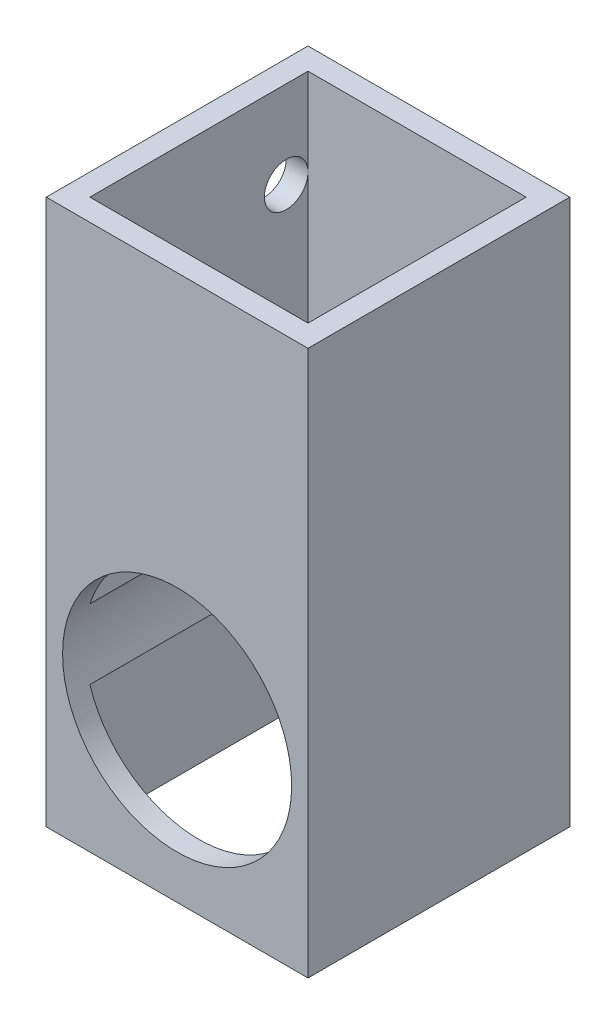
ISO-10303-21;
HEADER;
FILE_DESCRIPTION(('STEP AP214'),'2;1');
FILE_NAME('part.step','',(''),(''),'','','');
FILE_SCHEMA(('AUTOMOTIVE_DESIGN { 1 0 10303 214 1 1 1 1 }'));
ENDSEC;
DATA;
#1=APPLICATION_CONTEXT('core data for automotive mechanical design processes');
#2=APPLICATION_PROTOCOL_DEFINITION('international standard','automotive_design',2000,#1);
#3=PRODUCT_CONTEXT('',#1,'mechanical');
#4=PRODUCT('Part','Part','',(#3));
#5=PRODUCT_RELATED_PRODUCT_CATEGORY('part','',(#4));
#6=PRODUCT_DEFINITION_FORMATION('','',#4);
#7=PRODUCT_DEFINITION_CONTEXT('part definition',#1,'design');
#8=PRODUCT_DEFINITION('design','',#6,#7);
#9=PRODUCT_DEFINITION_SHAPE('','',#8);
#10=(LENGTH_UNIT() NAMED_UNIT(*) SI_UNIT(.MILLI.,.METRE.));
#11=(NAMED_UNIT(*) PLANE_ANGLE_UNIT() SI_UNIT($,.RADIAN.));
#12=(NAMED_UNIT(*) SI_UNIT($,.STERADIAN.) SOLID_ANGLE_UNIT());
#13=UNCERTAINTY_MEASURE_WITH_UNIT(LENGTH_MEASURE(1.E-05),#10,'distance_accuracy_value','');
#14=(GEOMETRIC_REPRESENTATION_CONTEXT(3) GLOBAL_UNCERTAINTY_ASSIGNED_CONTEXT((#13)) GLOBAL_UNIT_ASSIGNED_CONTEXT((#10,
#11,#12)) REPRESENTATION_CONTEXT('',''));
#15=CARTESIAN_POINT('',(0.,0.,0.));
#16=DIRECTION('',(0.,0.,1.));
#17=DIRECTION('',(1.,0.,0.));
#18=AXIS2_PLACEMENT_3D('',#15,#16,#17);
#19=CARTESIAN_POINT('',(12.1552561210692,66.675,-6.35));
#20=DIRECTION('',(-1.,0.,0.));
#21=DIRECTION('',(0.,0.,1.));
#22=AXIS2_PLACEMENT_3D('',#19,#20,#21);
#23=CYLINDRICAL_SURFACE('',#22,3.175);
#24=CARTESIAN_POINT('',(3.175,66.675,-6.35));
#25=DIRECTION('',(-1.,0.,0.));
#26=DIRECTION('',(0.,0.,1.));
#27=AXIS2_PLACEMENT_3D('',#24,#25,#26);
#28=CIRCLE('',#27,3.175);
#29=CARTESIAN_POINT('',(3.175,66.675,-3.175));
#30=VERTEX_POINT('',#29);
#31=EDGE_CURVE('E113',#30,#30,#28,.T.);
#32=ORIENTED_EDGE('',*,*,#31,.F.);
#33=EDGE_LOOP('',(#32));
#34=FACE_BOUND('',#33,.T.);
#35=CARTESIAN_POINT('',(0.,66.675,-6.35));
#36=DIRECTION('',(-1.,0.,0.));
#37=DIRECTION('',(0.,0.,1.));
#38=AXIS2_PLACEMENT_3D('',#35,#36,#37);
#39=CIRCLE('',#38,3.175);
#40=CARTESIAN_POINT('',(0.,66.675,-3.175));
#41=VERTEX_POINT('',#40);
#42=EDGE_CURVE('E198',#41,#41,#39,.T.);
#43=ORIENTED_EDGE('',*,*,#42,.T.);
#44=EDGE_LOOP('',(#43));
#45=FACE_BOUND('',#44,.T.);
#46=ADVANCED_FACE('F16',(#34,#45),#23,.F.);
#47=CARTESIAN_POINT('',(12.1552561210692,66.675,-31.75));
#48=DIRECTION('',(-1.,0.,0.));
#49=DIRECTION('',(0.,0.,1.));
#50=AXIS2_PLACEMENT_3D('',#47,#48,#49);
#51=CYLINDRICAL_SURFACE('',#50,3.175);
#52=CARTESIAN_POINT('',(3.175,66.675,-31.75));
#53=DIRECTION('',(-1.,0.,0.));
#54=DIRECTION('',(0.,0.,1.));
#55=AXIS2_PLACEMENT_3D('',#52,#53,#54);
#56=CIRCLE('',#55,3.175);
#57=CARTESIAN_POINT('',(3.175,66.675,-28.575));
#58=VERTEX_POINT('',#57);
#59=EDGE_CURVE('E208',#58,#58,#56,.T.);
#60=ORIENTED_EDGE('',*,*,#59,.F.);
#61=EDGE_LOOP('',(#60));
#62=FACE_BOUND('',#61,.T.);
#63=CARTESIAN_POINT('',(0.,66.675,-31.75));
#64=DIRECTION('',(-1.,0.,0.));
#65=DIRECTION('',(0.,0.,1.));
#66=AXIS2_PLACEMENT_3D('',#63,#64,#65);
#67=CIRCLE('',#66,3.175);
#68=CARTESIAN_POINT('',(0.,66.675,-28.575));
#69=VERTEX_POINT('',#68);
#70=EDGE_CURVE('E195',#69,#69,#67,.T.);
#71=ORIENTED_EDGE('',*,*,#70,.T.);
#72=EDGE_LOOP('',(#71));
#73=FACE_BOUND('',#72,.T.);
#74=ADVANCED_FACE('F217',(#62,#73),#51,.F.);
#75=CARTESIAN_POINT('',(12.1552561210692,53.975,-19.05));
#76=DIRECTION('',(-1.,0.,0.));
#77=DIRECTION('',(0.,0.,1.));
#78=AXIS2_PLACEMENT_3D('',#75,#76,#77);
#79=CYLINDRICAL_SURFACE('',#78,3.175);
#80=CARTESIAN_POINT('',(3.175,53.975,-19.05));
#81=DIRECTION('',(-1.,0.,0.));
#82=DIRECTION('',(0.,0.,1.));
#83=AXIS2_PLACEMENT_3D('',#80,#81,#82);
#84=CIRCLE('',#83,3.175);
#85=CARTESIAN_POINT('',(3.175,53.975,-15.875));
#86=VERTEX_POINT('',#85);
#87=EDGE_CURVE('E19',#86,#86,#84,.T.);
#88=ORIENTED_EDGE('',*,*,#87,.F.);
#89=EDGE_LOOP('',(#88));
#90=FACE_BOUND('',#89,.T.);
#91=CARTESIAN_POINT('',(0.,53.975,-19.05));
#92=DIRECTION('',(-1.,0.,0.));
#93=DIRECTION('',(0.,0.,1.));
#94=AXIS2_PLACEMENT_3D('',#91,#92,#93);
#95=CIRCLE('',#94,3.175);
#96=CARTESIAN_POINT('',(0.,53.975,-15.875));
#97=VERTEX_POINT('',#96);
#98=EDGE_CURVE('E163',#97,#97,#95,.T.);
#99=ORIENTED_EDGE('',*,*,#98,.T.);
#100=EDGE_LOOP('',(#99));
#101=FACE_BOUND('',#100,.T.);
#102=ADVANCED_FACE('F298',(#90,#101),#79,.F.);
#103=CARTESIAN_POINT('',(34.925,79.375,-3.175));
#104=DIRECTION('',(-1.,0.,0.));
#105=DIRECTION('',(0.,0.,1.));
#106=AXIS2_PLACEMENT_3D('',#103,#104,#105);
#107=PLANE('',#106);
#108=DIRECTION('',(0.,0.,-1.));
#109=VECTOR('',#108,1.);
#110=CARTESIAN_POINT('',(34.925,79.375,0.));
#111=LINE('',#110,#109);
#112=CARTESIAN_POINT('',(34.925,79.375,-3.175));
#113=VERTEX_POINT('',#112);
#114=CARTESIAN_POINT('',(34.925,79.375,-34.925));
#115=VERTEX_POINT('',#114);
#116=EDGE_CURVE('E126',#113,#115,#111,.T.);
#117=ORIENTED_EDGE('',*,*,#116,.T.);
#118=DIRECTION('',(0.,1.,0.));
#119=VECTOR('',#118,1.);
#120=CARTESIAN_POINT('',(34.925,79.375,-34.925));
#121=LINE('',#120,#119);
#122=CARTESIAN_POINT('',(34.925,28.1012298634623,-34.925));
#123=VERTEX_POINT('',#122);
#124=EDGE_CURVE('E125',#123,#115,#121,.T.);
#125=ORIENTED_EDGE('',*,*,#124,.F.);
#126=DIRECTION('',(0.,0.,1.));
#127=VECTOR('',#126,1.);
#128=CARTESIAN_POINT('',(34.925,28.1012298634623,-38.1));
#129=LINE('',#128,#127);
#130=CARTESIAN_POINT('',(34.925,28.1012298634623,-3.175));
#131=VERTEX_POINT('',#130);
#132=EDGE_CURVE('E177',#123,#131,#129,.T.);
#133=ORIENTED_EDGE('',*,*,#132,.T.);
#134=DIRECTION('',(0.,1.,0.));
#135=VECTOR('',#134,1.);
#136=CARTESIAN_POINT('',(34.925,79.375,-3.175));
#137=LINE('',#136,#135);
#138=EDGE_CURVE('E205',#113,#131,#137,.F.);
#139=ORIENTED_EDGE('',*,*,#138,.F.);
#140=EDGE_LOOP('',(#117,#125,#133,#139));
#141=FACE_BOUND('',#140,.T.);
#142=ADVANCED_FACE('F296',(#141),#107,.T.);
#143=CARTESIAN_POINT('',(3.175,79.375,-34.925));
#144=DIRECTION('',(0.,0.,1.));
#145=DIRECTION('',(1.,0.,0.));
#146=AXIS2_PLACEMENT_3D('',#143,#144,#145);
#147=PLANE('',#146);
#148=DIRECTION('',(0.,1.,0.));
#149=VECTOR('',#148,1.);
#150=CARTESIAN_POINT('',(3.175,79.375,-34.925));
#151=LINE('',#150,#149);
#152=CARTESIAN_POINT('',(3.175,28.1012298634623,-34.925));
#153=VERTEX_POINT('',#152);
#154=CARTESIAN_POINT('',(3.175,79.375,-34.925));
#155=VERTEX_POINT('',#154);
#156=EDGE_CURVE('E102',#153,#155,#151,.T.);
#157=ORIENTED_EDGE('',*,*,#156,.F.);
#158=CARTESIAN_POINT('',(19.05,23.01875,-34.925));
#159=DIRECTION('',(0.,0.,1.));
#160=DIRECTION('',(1.,0.,0.));
#161=AXIS2_PLACEMENT_3D('',#158,#159,#160);
#162=CIRCLE('',#161,16.66875);
#163=EDGE_CURVE('E181',#153,#123,#162,.F.);
#164=ORIENTED_EDGE('',*,*,#163,.T.);
#165=ORIENTED_EDGE('',*,*,#124,.T.);
#166=DIRECTION('',(1.,0.,0.));
#167=VECTOR('',#166,1.);
#168=CARTESIAN_POINT('',(0.,79.375,-34.925));
#169=LINE('',#168,#167);
#170=EDGE_CURVE('E119',#115,#155,#169,.F.);
#171=ORIENTED_EDGE('',*,*,#170,.T.);
#172=EDGE_LOOP('',(#157,#164,#165,#171));
#173=FACE_BOUND('',#172,.T.);
#174=ADVANCED_FACE('F124',(#173),#147,.T.);
#175=CARTESIAN_POINT('',(3.175,79.375,-3.175));
#176=DIRECTION('',(1.,0.,0.));
#177=DIRECTION('',(0.,0.,-1.));
#178=AXIS2_PLACEMENT_3D('',#175,#176,#177);
#179=PLANE('',#178);
#180=ORIENTED_EDGE('',*,*,#59,.T.);
#181=EDGE_LOOP('',(#180));
#182=FACE_BOUND('',#181,.T.);
#183=ORIENTED_EDGE('',*,*,#31,.T.);
#184=EDGE_LOOP('',(#183));
#185=FACE_BOUND('',#184,.T.);
#186=ORIENTED_EDGE('',*,*,#156,.T.);
#187=DIRECTION('',(0.,0.,-1.));
#188=VECTOR('',#187,1.);
#189=CARTESIAN_POINT('',(3.175,79.375,-3.175));
#190=LINE('',#189,#188);
#191=CARTESIAN_POINT('',(3.175,79.375,-3.175));
#192=VERTEX_POINT('',#191);
#193=EDGE_CURVE('E106',#155,#192,#190,.F.);
#194=ORIENTED_EDGE('',*,*,#193,.T.);
#195=DIRECTION('',(0.,1.,0.));
#196=VECTOR('',#195,1.);
#197=CARTESIAN_POINT('',(3.175,79.375,-3.175));
#198=LINE('',#197,#196);
#199=CARTESIAN_POINT('',(3.175,28.1012298634623,-3.175));
#200=VERTEX_POINT('',#199);
#201=EDGE_CURVE('E206',#200,#192,#198,.T.);
#202=ORIENTED_EDGE('',*,*,#201,.F.);
#203=DIRECTION('',(0.,0.,-1.));
#204=VECTOR('',#203,1.);
#205=CARTESIAN_POINT('',(3.175,28.1012298634623,-3.175));
#206=LINE('',#205,#204);
#207=EDGE_CURVE('E108',#200,#153,#206,.T.);
#208=ORIENTED_EDGE('',*,*,#207,.T.);
#209=EDGE_LOOP('',(#186,#194,#202,#208));
#210=FACE_BOUND('',#209,.T.);
#211=ORIENTED_EDGE('',*,*,#87,.T.);
#212=EDGE_LOOP('',(#211));
#213=FACE_BOUND('',#212,.T.);
#214=ADVANCED_FACE('F104',(#182,#185,#210,#213),#179,.T.);
#215=CARTESIAN_POINT('',(3.175,79.375,-3.175));
#216=DIRECTION('',(0.,0.,-1.));
#217=DIRECTION('',(-1.,0.,0.));
#218=AXIS2_PLACEMENT_3D('',#215,#216,#217);
#219=PLANE('',#218);
#220=DIRECTION('',(1.,0.,0.));
#221=VECTOR('',#220,1.);
#222=CARTESIAN_POINT('',(0.,79.375,-3.175));
#223=LINE('',#222,#221);
#224=EDGE_CURVE('E122',#192,#113,#223,.T.);
#225=ORIENTED_EDGE('',*,*,#224,.T.);
#226=ORIENTED_EDGE('',*,*,#138,.T.);
#227=CARTESIAN_POINT('',(19.05,23.01875,-3.175));
#228=DIRECTION('',(0.,0.,1.));
#229=DIRECTION('',(1.,0.,0.));
#230=AXIS2_PLACEMENT_3D('',#227,#228,#229);
#231=CIRCLE('',#230,16.66875);
#232=EDGE_CURVE('E180',#131,#200,#231,.T.);
#233=ORIENTED_EDGE('',*,*,#232,.T.);
#234=ORIENTED_EDGE('',*,*,#201,.T.);
#235=EDGE_LOOP('',(#225,#226,#233,#234));
#236=FACE_BOUND('',#235,.T.);
#237=ADVANCED_FACE('F234',(#236),#219,.T.);
#238=CARTESIAN_POINT('',(19.05,23.01875,-38.1));
#239=DIRECTION('',(0.,0.,1.));
#240=DIRECTION('',(1.,0.,0.));
#241=AXIS2_PLACEMENT_3D('',#238,#239,#240);
#242=CYLINDRICAL_SURFACE('',#241,16.66875);
#243=CARTESIAN_POINT('',(19.05,23.01875,-38.1));
#244=DIRECTION('',(0.,0.,1.));
#245=DIRECTION('',(1.,0.,0.));
#246=AXIS2_PLACEMENT_3D('',#243,#244,#245);
#247=CIRCLE('',#246,16.66875);
#248=CARTESIAN_POINT('',(35.71875,23.01875,-38.1));
#249=VERTEX_POINT('',#248);
#250=EDGE_CURVE('E137',#249,#249,#247,.F.);
#251=ORIENTED_EDGE('',*,*,#250,.T.);
#252=EDGE_LOOP('',(#251));
#253=FACE_BOUND('',#252,.T.);
#254=ORIENTED_EDGE('',*,*,#132,.F.);
#255=ORIENTED_EDGE('',*,*,#163,.F.);
#256=ORIENTED_EDGE('',*,*,#207,.F.);
#257=ORIENTED_EDGE('',*,*,#232,.F.);
#258=EDGE_LOOP('',(#254,#255,#256,#257));
#259=FACE_BOUND('',#258,.T.);
#260=CARTESIAN_POINT('',(19.05,23.01875,0.));
#261=DIRECTION('',(0.,0.,1.));
#262=DIRECTION('',(1.,0.,0.));
#263=AXIS2_PLACEMENT_3D('',#260,#261,#262);
#264=CIRCLE('',#263,16.66875);
#265=CARTESIAN_POINT('',(35.71875,23.01875,0.));
#266=VERTEX_POINT('',#265);
#267=EDGE_CURVE('E185',#266,#266,#264,.T.);
#268=ORIENTED_EDGE('',*,*,#267,.T.);
#269=EDGE_LOOP('',(#268));
#270=FACE_BOUND('',#269,.T.);
#271=DIRECTION('',(0.,0.,-1.));
#272=VECTOR('',#271,1.);
#273=CARTESIAN_POINT('',(3.175,17.9362701365377,-3.175));
#274=LINE('',#273,#272);
#275=CARTESIAN_POINT('',(3.175,17.9362701365377,-34.925));
#276=VERTEX_POINT('',#275);
#277=CARTESIAN_POINT('',(3.175,17.9362701365377,-3.175));
#278=VERTEX_POINT('',#277);
#279=EDGE_CURVE('E160',#276,#278,#274,.F.);
#280=ORIENTED_EDGE('',*,*,#279,.F.);
#281=CARTESIAN_POINT('',(19.05,23.01875,-34.925));
#282=DIRECTION('',(0.,0.,1.));
#283=DIRECTION('',(1.,0.,0.));
#284=AXIS2_PLACEMENT_3D('',#281,#282,#283);
#285=CIRCLE('',#284,16.66875);
#286=CARTESIAN_POINT('',(34.925,17.9362701365377,-34.925));
#287=VERTEX_POINT('',#286);
#288=EDGE_CURVE('E171',#287,#276,#285,.F.);
#289=ORIENTED_EDGE('',*,*,#288,.F.);
#290=DIRECTION('',(0.,0.,1.));
#291=VECTOR('',#290,1.);
#292=CARTESIAN_POINT('',(34.925,17.9362701365377,-3.175));
#293=LINE('',#292,#291);
#294=CARTESIAN_POINT('',(34.925,17.9362701365377,-3.175));
#295=VERTEX_POINT('',#294);
#296=EDGE_CURVE('E145',#295,#287,#293,.F.);
#297=ORIENTED_EDGE('',*,*,#296,.F.);
#298=CARTESIAN_POINT('',(19.05,23.01875,-3.175));
#299=DIRECTION('',(0.,0.,1.));
#300=DIRECTION('',(1.,0.,0.));
#301=AXIS2_PLACEMENT_3D('',#298,#299,#300);
#302=CIRCLE('',#301,16.66875);
#303=EDGE_CURVE('E162',#278,#295,#302,.T.);
#304=ORIENTED_EDGE('',*,*,#303,.F.);
#305=EDGE_LOOP('',(#280,#289,#297,#304));
#306=FACE_BOUND('',#305,.T.);
#307=ADVANCED_FACE('F223',(#253,#259,#270,#306),#242,.F.);
#308=CARTESIAN_POINT('',(0.,79.375,0.));
#309=DIRECTION('',(1.,0.,0.));
#310=DIRECTION('',(0.,0.,-1.));
#311=AXIS2_PLACEMENT_3D('',#308,#309,#310);
#312=PLANE('',#311);
#313=DIRECTION('',(0.,1.,0.));
#314=VECTOR('',#313,1.);
#315=CARTESIAN_POINT('',(0.,79.375,0.));
#316=LINE('',#315,#314);
#317=CARTESIAN_POINT('',(0.,0.,0.));
#318=VERTEX_POINT('',#317);
#319=CARTESIAN_POINT('',(0.,79.375,0.));
#320=VERTEX_POINT('',#319);
#321=EDGE_CURVE('E188',#318,#320,#316,.T.);
#322=ORIENTED_EDGE('',*,*,#321,.T.);
#323=DIRECTION('',(0.,0.,-1.));
#324=VECTOR('',#323,1.);
#325=CARTESIAN_POINT('',(0.,79.375,0.));
#326=LINE('',#325,#324);
#327=CARTESIAN_POINT('',(0.,79.375,-38.1));
#328=VERTEX_POINT('',#327);
#329=EDGE_CURVE('E128',#320,#328,#326,.T.);
#330=ORIENTED_EDGE('',*,*,#329,.T.);
#331=DIRECTION('',(0.,1.,0.));
#332=VECTOR('',#331,1.);
#333=CARTESIAN_POINT('',(0.,79.375,-38.1));
#334=LINE('',#333,#332);
#335=CARTESIAN_POINT('',(0.,0.,-38.1));
#336=VERTEX_POINT('',#335);
#337=EDGE_CURVE('E450',#328,#336,#334,.F.);
#338=ORIENTED_EDGE('',*,*,#337,.T.);
#339=DIRECTION('',(0.,0.,-1.));
#340=VECTOR('',#339,1.);
#341=CARTESIAN_POINT('',(0.,0.,0.));
#342=LINE('',#341,#340);
#343=EDGE_CURVE('E453',#318,#336,#342,.T.);
#344=ORIENTED_EDGE('',*,*,#343,.F.);
#345=EDGE_LOOP('',(#322,#330,#338,#344));
#346=FACE_BOUND('',#345,.T.);
#347=ORIENTED_EDGE('',*,*,#98,.F.);
#348=EDGE_LOOP('',(#347));
#349=FACE_BOUND('',#348,.T.);
#350=ORIENTED_EDGE('',*,*,#70,.F.);
#351=EDGE_LOOP('',(#350));
#352=FACE_BOUND('',#351,.T.);
#353=ORIENTED_EDGE('',*,*,#42,.F.);
#354=EDGE_LOOP('',(#353));
#355=FACE_BOUND('',#354,.T.);
#356=ADVANCED_FACE('F220',(#346,#349,#352,#355),#312,.F.);
#357=CARTESIAN_POINT('',(3.175,79.375,-3.175));
#358=DIRECTION('',(1.,0.,0.));
#359=DIRECTION('',(0.,0.,-1.));
#360=AXIS2_PLACEMENT_3D('',#357,#358,#359);
#361=PLANE('',#360);
#362=DIRECTION('',(0.,0.,-1.));
#363=VECTOR('',#362,1.);
#364=CARTESIAN_POINT('',(3.175,0.,0.));
#365=LINE('',#364,#363);
#366=CARTESIAN_POINT('',(3.175,0.,-34.925));
#367=VERTEX_POINT('',#366);
#368=CARTESIAN_POINT('',(3.175,0.,-3.175));
#369=VERTEX_POINT('',#368);
#370=EDGE_CURVE('E164',#367,#369,#365,.F.);
#371=ORIENTED_EDGE('',*,*,#370,.F.);
#372=DIRECTION('',(0.,1.,0.));
#373=VECTOR('',#372,1.);
#374=CARTESIAN_POINT('',(3.17500000000001,79.375,-34.925));
#375=LINE('',#374,#373);
#376=EDGE_CURVE('E191',#276,#367,#375,.F.);
#377=ORIENTED_EDGE('',*,*,#376,.F.);
#378=ORIENTED_EDGE('',*,*,#279,.T.);
#379=DIRECTION('',(0.,1.,0.));
#380=VECTOR('',#379,1.);
#381=CARTESIAN_POINT('',(3.175,79.375,-3.175));
#382=LINE('',#381,#380);
#383=EDGE_CURVE('E148',#369,#278,#382,.T.);
#384=ORIENTED_EDGE('',*,*,#383,.F.);
#385=EDGE_LOOP('',(#371,#377,#378,#384));
#386=FACE_BOUND('',#385,.T.);
#387=ADVANCED_FACE('F222',(#386),#361,.T.);
#388=CARTESIAN_POINT('',(3.175,79.375,-3.175));
#389=DIRECTION('',(0.,0.,-1.));
#390=DIRECTION('',(-1.,0.,0.));
#391=AXIS2_PLACEMENT_3D('',#388,#389,#390);
#392=PLANE('',#391);
#393=DIRECTION('',(1.,0.,0.));
#394=VECTOR('',#393,1.);
#395=CARTESIAN_POINT('',(0.,0.,-3.175));
#396=LINE('',#395,#394);
#397=CARTESIAN_POINT('',(34.925,0.,-3.175));
#398=VERTEX_POINT('',#397);
#399=EDGE_CURVE('E152',#369,#398,#396,.T.);
#400=ORIENTED_EDGE('',*,*,#399,.F.);
#401=ORIENTED_EDGE('',*,*,#383,.T.);
#402=ORIENTED_EDGE('',*,*,#303,.T.);
#403=DIRECTION('',(0.,1.,0.));
#404=VECTOR('',#403,1.);
#405=CARTESIAN_POINT('',(34.925,79.375,-3.175));
#406=LINE('',#405,#404);
#407=EDGE_CURVE('E147',#398,#295,#406,.T.);
#408=ORIENTED_EDGE('',*,*,#407,.F.);
#409=EDGE_LOOP('',(#400,#401,#402,#408));
#410=FACE_BOUND('',#409,.T.);
#411=ADVANCED_FACE('F231',(#410),#392,.T.);
#412=CARTESIAN_POINT('',(34.925,79.375,-3.175));
#413=DIRECTION('',(-1.,0.,0.));
#414=DIRECTION('',(0.,0.,1.));
#415=AXIS2_PLACEMENT_3D('',#412,#413,#414);
#416=PLANE('',#415);
#417=DIRECTION('',(0.,0.,-1.));
#418=VECTOR('',#417,1.);
#419=CARTESIAN_POINT('',(34.925,0.,0.));
#420=LINE('',#419,#418);
#421=CARTESIAN_POINT('',(34.925,0.,-34.925));
#422=VERTEX_POINT('',#421);
#423=EDGE_CURVE('E149',#398,#422,#420,.T.);
#424=ORIENTED_EDGE('',*,*,#423,.F.);
#425=ORIENTED_EDGE('',*,*,#407,.T.);
#426=ORIENTED_EDGE('',*,*,#296,.T.);
#427=DIRECTION('',(0.,1.,0.));
#428=VECTOR('',#427,1.);
#429=CARTESIAN_POINT('',(34.925,79.375,-34.925));
#430=LINE('',#429,#428);
#431=EDGE_CURVE('E189',#422,#287,#430,.T.);
#432=ORIENTED_EDGE('',*,*,#431,.F.);
#433=EDGE_LOOP('',(#424,#425,#426,#432));
#434=FACE_BOUND('',#433,.T.);
#435=ADVANCED_FACE('F263',(#434),#416,.T.);
#436=CARTESIAN_POINT('',(3.175,79.375,-34.925));
#437=DIRECTION('',(0.,0.,1.));
#438=DIRECTION('',(1.,0.,0.));
#439=AXIS2_PLACEMENT_3D('',#436,#437,#438);
#440=PLANE('',#439);
#441=DIRECTION('',(1.,0.,0.));
#442=VECTOR('',#441,1.);
#443=CARTESIAN_POINT('',(0.,0.,-34.925));
#444=LINE('',#443,#442);
#445=EDGE_CURVE('E151',#422,#367,#444,.F.);
#446=ORIENTED_EDGE('',*,*,#445,.F.);
#447=ORIENTED_EDGE('',*,*,#431,.T.);
#448=ORIENTED_EDGE('',*,*,#288,.T.);
#449=ORIENTED_EDGE('',*,*,#376,.T.);
#450=EDGE_LOOP('',(#446,#447,#448,#449));
#451=FACE_BOUND('',#450,.T.);
#452=ADVANCED_FACE('F259',(#451),#440,.T.);
#453=CARTESIAN_POINT('',(0.,79.375,0.));
#454=DIRECTION('',(0.,0.,-1.));
#455=DIRECTION('',(-1.,0.,0.));
#456=AXIS2_PLACEMENT_3D('',#453,#454,#455);
#457=PLANE('',#456);
#458=DIRECTION('',(0.,1.,0.));
#459=VECTOR('',#458,1.);
#460=CARTESIAN_POINT('',(38.1,79.375,0.));
#461=LINE('',#460,#459);
#462=CARTESIAN_POINT('',(38.1,0.,0.));
#463=VERTEX_POINT('',#462);
#464=CARTESIAN_POINT('',(38.1,79.375,0.));
#465=VERTEX_POINT('',#464);
#466=EDGE_CURVE('E157',#463,#465,#461,.T.);
#467=ORIENTED_EDGE('',*,*,#466,.T.);
#468=DIRECTION('',(1.,0.,0.));
#469=VECTOR('',#468,1.);
#470=CARTESIAN_POINT('',(0.,79.375,0.));
#471=LINE('',#470,#469);
#472=EDGE_CURVE('E444',#465,#320,#471,.F.);
#473=ORIENTED_EDGE('',*,*,#472,.T.);
#474=ORIENTED_EDGE('',*,*,#321,.F.);
#475=DIRECTION('',(1.,0.,0.));
#476=VECTOR('',#475,1.);
#477=CARTESIAN_POINT('',(0.,0.,0.));
#478=LINE('',#477,#476);
#479=EDGE_CURVE('E166',#463,#318,#478,.F.);
#480=ORIENTED_EDGE('',*,*,#479,.F.);
#481=EDGE_LOOP('',(#467,#473,#474,#480));
#482=FACE_BOUND('',#481,.T.);
#483=ORIENTED_EDGE('',*,*,#267,.F.);
#484=EDGE_LOOP('',(#483));
#485=FACE_BOUND('',#484,.T.);
#486=ADVANCED_FACE('F256',(#482,#485),#457,.F.);
#487=CARTESIAN_POINT('',(0.,79.375,0.));
#488=DIRECTION('',(0.,-1.,0.));
#489=DIRECTION('',(0.,0.,-1.));
#490=AXIS2_PLACEMENT_3D('',#487,#488,#489);
#491=PLANE('',#490);
#492=ORIENTED_EDGE('',*,*,#193,.F.);
#493=ORIENTED_EDGE('',*,*,#170,.F.);
#494=ORIENTED_EDGE('',*,*,#116,.F.);
#495=ORIENTED_EDGE('',*,*,#224,.F.);
#496=EDGE_LOOP('',(#492,#493,#494,#495));
#497=FACE_BOUND('',#496,.T.);
#498=ORIENTED_EDGE('',*,*,#472,.F.);
#499=DIRECTION('',(0.,0.,1.));
#500=VECTOR('',#499,1.);
#501=CARTESIAN_POINT('',(38.1,79.375,0.));
#502=LINE('',#501,#500);
#503=CARTESIAN_POINT('',(38.1,79.375,-38.1));
#504=VERTEX_POINT('',#503);
#505=EDGE_CURVE('E460',#465,#504,#502,.F.);
#506=ORIENTED_EDGE('',*,*,#505,.T.);
#507=DIRECTION('',(1.,0.,0.));
#508=VECTOR('',#507,1.);
#509=CARTESIAN_POINT('',(0.,79.375,-38.1));
#510=LINE('',#509,#508);
#511=EDGE_CURVE('E183',#504,#328,#510,.F.);
#512=ORIENTED_EDGE('',*,*,#511,.T.);
#513=ORIENTED_EDGE('',*,*,#329,.F.);
#514=EDGE_LOOP('',(#498,#506,#512,#513));
#515=FACE_BOUND('',#514,.T.);
#516=ADVANCED_FACE('F117',(#497,#515),#491,.F.);
#517=CARTESIAN_POINT('',(0.,79.375,-38.1));
#518=DIRECTION('',(0.,0.,1.));
#519=DIRECTION('',(1.,0.,0.));
#520=AXIS2_PLACEMENT_3D('',#517,#518,#519);
#521=PLANE('',#520);
#522=ORIENTED_EDGE('',*,*,#337,.F.);
#523=ORIENTED_EDGE('',*,*,#511,.F.);
#524=DIRECTION('',(0.,1.,0.));
#525=VECTOR('',#524,1.);
#526=CARTESIAN_POINT('',(38.1,79.375,-38.1));
#527=LINE('',#526,#525);
#528=CARTESIAN_POINT('',(38.1,0.,-38.1));
#529=VERTEX_POINT('',#528);
#530=EDGE_CURVE('E25',#504,#529,#527,.F.);
#531=ORIENTED_EDGE('',*,*,#530,.T.);
#532=DIRECTION('',(1.,0.,0.));
#533=VECTOR('',#532,1.);
#534=CARTESIAN_POINT('',(0.,0.,-38.1));
#535=LINE('',#534,#533);
#536=EDGE_CURVE('E33',#336,#529,#535,.T.);
#537=ORIENTED_EDGE('',*,*,#536,.F.);
#538=EDGE_LOOP('',(#522,#523,#531,#537));
#539=FACE_BOUND('',#538,.T.);
#540=ORIENTED_EDGE('',*,*,#250,.F.);
#541=EDGE_LOOP('',(#540));
#542=FACE_BOUND('',#541,.T.);
#543=ADVANCED_FACE('F246',(#539,#542),#521,.F.);
#544=CARTESIAN_POINT('',(0.,0.,0.));
#545=DIRECTION('',(0.,-1.,0.));
#546=DIRECTION('',(0.,0.,-1.));
#547=AXIS2_PLACEMENT_3D('',#544,#545,#546);
#548=PLANE('',#547);
#549=ORIENTED_EDGE('',*,*,#423,.T.);
#550=ORIENTED_EDGE('',*,*,#445,.T.);
#551=ORIENTED_EDGE('',*,*,#370,.T.);
#552=ORIENTED_EDGE('',*,*,#399,.T.);
#553=EDGE_LOOP('',(#549,#550,#551,#552));
#554=FACE_BOUND('',#553,.T.);
#555=DIRECTION('',(0.,0.,1.));
#556=VECTOR('',#555,1.);
#557=CARTESIAN_POINT('',(38.1,0.,0.));
#558=LINE('',#557,#556);
#559=EDGE_CURVE('E11',#529,#463,#558,.T.);
#560=ORIENTED_EDGE('',*,*,#559,.T.);
#561=ORIENTED_EDGE('',*,*,#479,.T.);
#562=ORIENTED_EDGE('',*,*,#343,.T.);
#563=ORIENTED_EDGE('',*,*,#536,.T.);
#564=EDGE_LOOP('',(#560,#561,#562,#563));
#565=FACE_BOUND('',#564,.T.);
#566=ADVANCED_FACE('F240',(#554,#565),#548,.T.);
#567=CARTESIAN_POINT('',(38.1,79.375,0.));
#568=DIRECTION('',(-1.,0.,0.));
#569=DIRECTION('',(0.,0.,1.));
#570=AXIS2_PLACEMENT_3D('',#567,#568,#569);
#571=PLANE('',#570);
#572=ORIENTED_EDGE('',*,*,#530,.F.);
#573=ORIENTED_EDGE('',*,*,#505,.F.);
#574=ORIENTED_EDGE('',*,*,#466,.F.);
#575=ORIENTED_EDGE('',*,*,#559,.F.);
#576=EDGE_LOOP('',(#572,#573,#574,#575));
#577=FACE_BOUND('',#576,.T.);
#578=ADVANCED_FACE('F238',(#577),#571,.F.);
#579=CLOSED_SHELL('',(#46,#74,#102,#142,#174,#214,#237,#307,#356,#387,#411,#435,#452,#486,#516,
#543,#566,#578));
#580=MANIFOLD_SOLID_BREP('B1',#579);
#581=ADVANCED_BREP_SHAPE_REPRESENTATION('',(#18,#580),#14);
#582=SHAPE_DEFINITION_REPRESENTATION(#9,#581);
ENDSEC;
END-ISO-10303-21;
